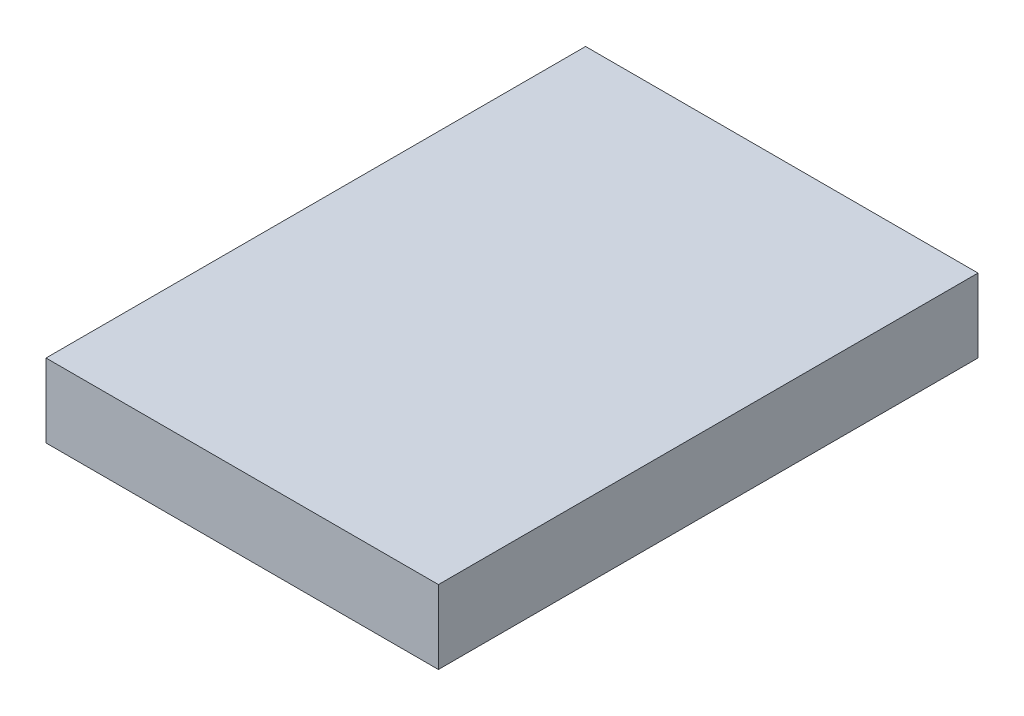
ISO-10303-21;
HEADER;
FILE_DESCRIPTION(('STEP AP214'),'2;1');
FILE_NAME('part.step','',(''),(''),'','','');
FILE_SCHEMA(('AUTOMOTIVE_DESIGN { 1 0 10303 214 1 1 1 1 }'));
ENDSEC;
DATA;
#1=APPLICATION_CONTEXT('core data for automotive mechanical design processes');
#2=APPLICATION_PROTOCOL_DEFINITION('international standard','automotive_design',2000,#1);
#3=PRODUCT_CONTEXT('',#1,'mechanical');
#4=PRODUCT('Part','Part','',(#3));
#5=PRODUCT_RELATED_PRODUCT_CATEGORY('part','',(#4));
#6=PRODUCT_DEFINITION_FORMATION('','',#4);
#7=PRODUCT_DEFINITION_CONTEXT('part definition',#1,'design');
#8=PRODUCT_DEFINITION('design','',#6,#7);
#9=PRODUCT_DEFINITION_SHAPE('','',#8);
#10=(LENGTH_UNIT() NAMED_UNIT(*) SI_UNIT(.MILLI.,.METRE.));
#11=(NAMED_UNIT(*) PLANE_ANGLE_UNIT() SI_UNIT($,.RADIAN.));
#12=(NAMED_UNIT(*) SI_UNIT($,.STERADIAN.) SOLID_ANGLE_UNIT());
#13=UNCERTAINTY_MEASURE_WITH_UNIT(LENGTH_MEASURE(1.E-05),#10,'distance_accuracy_value','');
#14=(GEOMETRIC_REPRESENTATION_CONTEXT(3) GLOBAL_UNCERTAINTY_ASSIGNED_CONTEXT((#13)) GLOBAL_UNIT_ASSIGNED_CONTEXT((#10,
#11,#12)) REPRESENTATION_CONTEXT('',''));
#15=CARTESIAN_POINT('',(0.,0.,0.));
#16=DIRECTION('',(0.,0.,1.));
#17=DIRECTION('',(1.,0.,0.));
#18=AXIS2_PLACEMENT_3D('',#15,#16,#17);
#19=CARTESIAN_POINT('',(50.8,-19.05,69.85));
#20=DIRECTION('',(1.,0.,0.));
#21=DIRECTION('',(0.,0.,-1.));
#22=AXIS2_PLACEMENT_3D('',#19,#20,#21);
#23=PLANE('',#22);
#24=DIRECTION('',(0.,0.,-1.));
#25=VECTOR('',#24,1.);
#26=CARTESIAN_POINT('',(50.8,0.,69.85));
#27=LINE('',#26,#25);
#28=CARTESIAN_POINT('',(50.8,0.,69.85));
#29=VERTEX_POINT('',#28);
#30=CARTESIAN_POINT('',(50.8,0.,-69.85));
#31=VERTEX_POINT('',#30);
#32=EDGE_CURVE('E115',#29,#31,#27,.T.);
#33=ORIENTED_EDGE('',*,*,#32,.F.);
#34=DIRECTION('',(0.,1.,0.));
#35=VECTOR('',#34,1.);
#36=CARTESIAN_POINT('',(50.8,-19.05,69.85));
#37=LINE('',#36,#35);
#38=CARTESIAN_POINT('',(50.8,-19.05,69.85));
#39=VERTEX_POINT('',#38);
#40=EDGE_CURVE('E11',#39,#29,#37,.T.);
#41=ORIENTED_EDGE('',*,*,#40,.F.);
#42=DIRECTION('',(0.,0.,-1.));
#43=VECTOR('',#42,1.);
#44=CARTESIAN_POINT('',(50.8,-19.05,69.85));
#45=LINE('',#44,#43);
#46=CARTESIAN_POINT('',(50.8,-19.05,-69.85));
#47=VERTEX_POINT('',#46);
#48=EDGE_CURVE('E107',#39,#47,#45,.T.);
#49=ORIENTED_EDGE('',*,*,#48,.T.);
#50=DIRECTION('',(0.,1.,0.));
#51=VECTOR('',#50,1.);
#52=CARTESIAN_POINT('',(50.8,-19.05,-69.85));
#53=LINE('',#52,#51);
#54=EDGE_CURVE('E48',#47,#31,#53,.T.);
#55=ORIENTED_EDGE('',*,*,#54,.T.);
#56=EDGE_LOOP('',(#33,#41,#49,#55));
#57=FACE_BOUND('',#56,.T.);
#58=ADVANCED_FACE('F45',(#57),#23,.T.);
#59=CARTESIAN_POINT('',(-50.8,-19.05,69.85));
#60=DIRECTION('',(0.,0.,1.));
#61=DIRECTION('',(1.,0.,0.));
#62=AXIS2_PLACEMENT_3D('',#59,#60,#61);
#63=PLANE('',#62);
#64=DIRECTION('',(1.,0.,0.));
#65=VECTOR('',#64,1.);
#66=CARTESIAN_POINT('',(-50.8,0.,69.85));
#67=LINE('',#66,#65);
#68=CARTESIAN_POINT('',(-50.8,0.,69.85));
#69=VERTEX_POINT('',#68);
#70=EDGE_CURVE('E110',#69,#29,#67,.T.);
#71=ORIENTED_EDGE('',*,*,#70,.F.);
#72=DIRECTION('',(0.,1.,0.));
#73=VECTOR('',#72,1.);
#74=CARTESIAN_POINT('',(-50.8,-19.05,69.85));
#75=LINE('',#74,#73);
#76=CARTESIAN_POINT('',(-50.8,-19.05,69.85));
#77=VERTEX_POINT('',#76);
#78=EDGE_CURVE('E55',#77,#69,#75,.T.);
#79=ORIENTED_EDGE('',*,*,#78,.F.);
#80=DIRECTION('',(1.,0.,0.));
#81=VECTOR('',#80,1.);
#82=CARTESIAN_POINT('',(-50.8,-19.05,69.85));
#83=LINE('',#82,#81);
#84=EDGE_CURVE('E102',#77,#39,#83,.T.);
#85=ORIENTED_EDGE('',*,*,#84,.T.);
#86=ORIENTED_EDGE('',*,*,#40,.T.);
#87=EDGE_LOOP('',(#71,#79,#85,#86));
#88=FACE_BOUND('',#87,.T.);
#89=ADVANCED_FACE('F131',(#88),#63,.T.);
#90=CARTESIAN_POINT('',(-50.8,-19.05,69.85));
#91=DIRECTION('',(-1.,0.,0.));
#92=DIRECTION('',(0.,0.,1.));
#93=AXIS2_PLACEMENT_3D('',#90,#91,#92);
#94=PLANE('',#93);
#95=DIRECTION('',(0.,0.,1.));
#96=VECTOR('',#95,1.);
#97=CARTESIAN_POINT('',(-50.8,0.,69.85));
#98=LINE('',#97,#96);
#99=CARTESIAN_POINT('',(-50.8,0.,-69.85));
#100=VERTEX_POINT('',#99);
#101=EDGE_CURVE('E96',#100,#69,#98,.T.);
#102=ORIENTED_EDGE('',*,*,#101,.F.);
#103=DIRECTION('',(0.,1.,0.));
#104=VECTOR('',#103,1.);
#105=CARTESIAN_POINT('',(-50.8,-19.05,-69.85));
#106=LINE('',#105,#104);
#107=CARTESIAN_POINT('',(-50.8,-19.05,-69.85));
#108=VERTEX_POINT('',#107);
#109=EDGE_CURVE('E91',#108,#100,#106,.T.);
#110=ORIENTED_EDGE('',*,*,#109,.F.);
#111=DIRECTION('',(0.,0.,1.));
#112=VECTOR('',#111,1.);
#113=CARTESIAN_POINT('',(-50.8,-19.05,69.85));
#114=LINE('',#113,#112);
#115=EDGE_CURVE('E94',#108,#77,#114,.T.);
#116=ORIENTED_EDGE('',*,*,#115,.T.);
#117=ORIENTED_EDGE('',*,*,#78,.T.);
#118=EDGE_LOOP('',(#102,#110,#116,#117));
#119=FACE_BOUND('',#118,.T.);
#120=ADVANCED_FACE('F93',(#119),#94,.T.);
#121=CARTESIAN_POINT('',(-50.8,-19.05,-69.85));
#122=DIRECTION('',(0.,0.,-1.));
#123=DIRECTION('',(-1.,0.,0.));
#124=AXIS2_PLACEMENT_3D('',#121,#122,#123);
#125=PLANE('',#124);
#126=DIRECTION('',(-1.,0.,0.));
#127=VECTOR('',#126,1.);
#128=CARTESIAN_POINT('',(-50.8,0.,-69.85));
#129=LINE('',#128,#127);
#130=EDGE_CURVE('E119',#31,#100,#129,.T.);
#131=ORIENTED_EDGE('',*,*,#130,.F.);
#132=ORIENTED_EDGE('',*,*,#54,.F.);
#133=DIRECTION('',(-1.,0.,0.));
#134=VECTOR('',#133,1.);
#135=CARTESIAN_POINT('',(-50.8,-19.05,-69.85));
#136=LINE('',#135,#134);
#137=EDGE_CURVE('E101',#47,#108,#136,.T.);
#138=ORIENTED_EDGE('',*,*,#137,.T.);
#139=ORIENTED_EDGE('',*,*,#109,.T.);
#140=EDGE_LOOP('',(#131,#132,#138,#139));
#141=FACE_BOUND('',#140,.T.);
#142=ADVANCED_FACE('F105',(#141),#125,.T.);
#143=CARTESIAN_POINT('',(0.,-19.05,0.));
#144=DIRECTION('',(0.,-1.,0.));
#145=DIRECTION('',(0.,0.,-1.));
#146=AXIS2_PLACEMENT_3D('',#143,#144,#145);
#147=PLANE('',#146);
#148=ORIENTED_EDGE('',*,*,#48,.F.);
#149=ORIENTED_EDGE('',*,*,#84,.F.);
#150=ORIENTED_EDGE('',*,*,#115,.F.);
#151=ORIENTED_EDGE('',*,*,#137,.F.);
#152=EDGE_LOOP('',(#148,#149,#150,#151));
#153=FACE_BOUND('',#152,.T.);
#154=ADVANCED_FACE('F100',(#153),#147,.T.);
#155=CARTESIAN_POINT('',(0.,0.,0.));
#156=DIRECTION('',(0.,-1.,0.));
#157=DIRECTION('',(0.,0.,-1.));
#158=AXIS2_PLACEMENT_3D('',#155,#156,#157);
#159=PLANE('',#158);
#160=ORIENTED_EDGE('',*,*,#32,.T.);
#161=ORIENTED_EDGE('',*,*,#130,.T.);
#162=ORIENTED_EDGE('',*,*,#101,.T.);
#163=ORIENTED_EDGE('',*,*,#70,.T.);
#164=EDGE_LOOP('',(#160,#161,#162,#163));
#165=FACE_BOUND('',#164,.T.);
#166=ADVANCED_FACE('F130',(#165),#159,.F.);
#167=CLOSED_SHELL('',(#58,#89,#120,#142,#154,#166));
#168=MANIFOLD_SOLID_BREP('B2',#167);
#169=ADVANCED_BREP_SHAPE_REPRESENTATION('',(#18,#168),#14);
#170=SHAPE_DEFINITION_REPRESENTATION(#9,#169);
ENDSEC;
END-ISO-10303-21;
